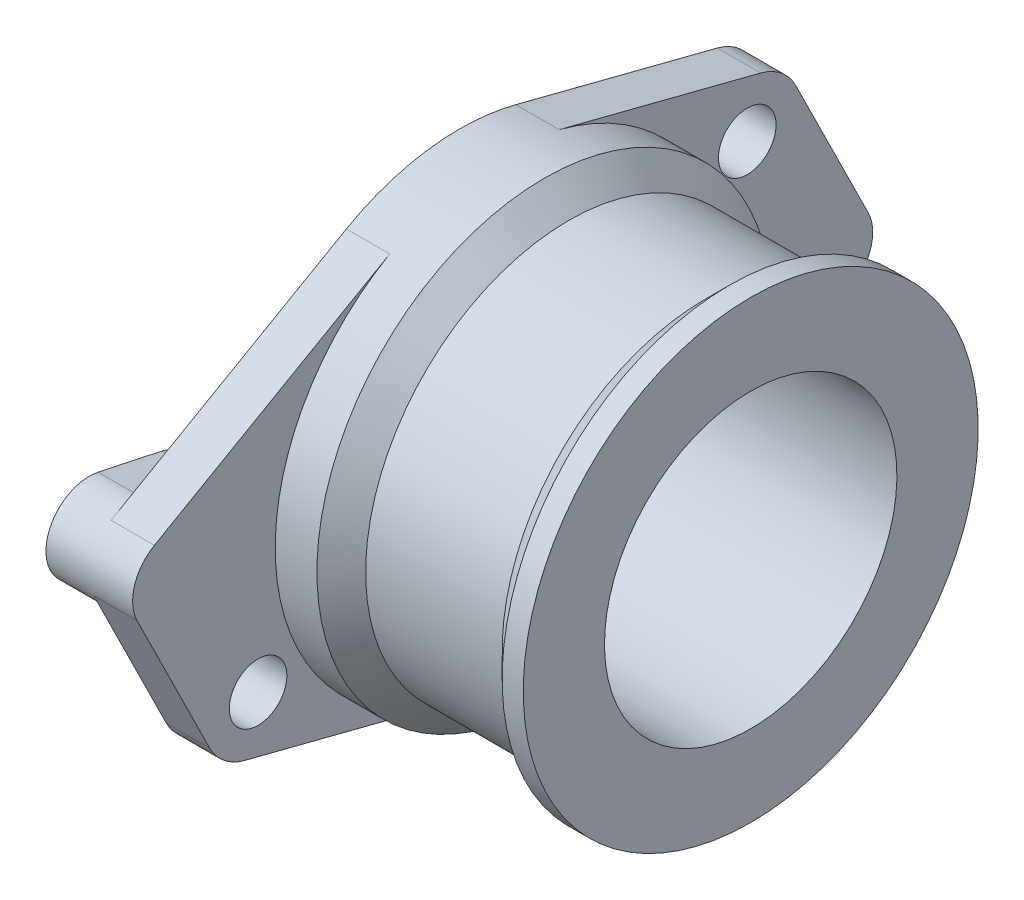
ISO-10303-21;
HEADER;
FILE_DESCRIPTION(('STEP AP214'),'2;1');
FILE_NAME('part.step','',(''),(''),'','','');
FILE_SCHEMA(('AUTOMOTIVE_DESIGN { 1 0 10303 214 1 1 1 1 }'));
ENDSEC;
DATA;
#1=APPLICATION_CONTEXT('core data for automotive mechanical design processes');
#2=APPLICATION_PROTOCOL_DEFINITION('international standard','automotive_design',2000,#1);
#3=PRODUCT_CONTEXT('',#1,'mechanical');
#4=PRODUCT('Part','Part','',(#3));
#5=PRODUCT_RELATED_PRODUCT_CATEGORY('part','',(#4));
#6=PRODUCT_DEFINITION_FORMATION('','',#4);
#7=PRODUCT_DEFINITION_CONTEXT('part definition',#1,'design');
#8=PRODUCT_DEFINITION('design','',#6,#7);
#9=PRODUCT_DEFINITION_SHAPE('','',#8);
#10=(LENGTH_UNIT() NAMED_UNIT(*) SI_UNIT(.MILLI.,.METRE.));
#11=(NAMED_UNIT(*) PLANE_ANGLE_UNIT() SI_UNIT($,.RADIAN.));
#12=(NAMED_UNIT(*) SI_UNIT($,.STERADIAN.) SOLID_ANGLE_UNIT());
#13=UNCERTAINTY_MEASURE_WITH_UNIT(LENGTH_MEASURE(1.E-05),#10,'distance_accuracy_value','');
#14=(GEOMETRIC_REPRESENTATION_CONTEXT(3) GLOBAL_UNCERTAINTY_ASSIGNED_CONTEXT((#13)) GLOBAL_UNIT_ASSIGNED_CONTEXT((#10,
#11,#12)) REPRESENTATION_CONTEXT('',''));
#15=CARTESIAN_POINT('',(0.,0.,0.));
#16=DIRECTION('',(0.,0.,1.));
#17=DIRECTION('',(1.,0.,0.));
#18=AXIS2_PLACEMENT_3D('',#15,#16,#17);
#19=CARTESIAN_POINT('',(25.4,0.,0.));
#20=DIRECTION('',(-1.,0.,0.));
#21=DIRECTION('',(0.,1.,0.));
#22=AXIS2_PLACEMENT_3D('',#19,#20,#21);
#23=CYLINDRICAL_SURFACE('',#22,17.145);
#24=CARTESIAN_POINT('',(0.,0.,0.));
#25=DIRECTION('',(-1.,0.,0.));
#26=DIRECTION('',(0.,1.,0.));
#27=AXIS2_PLACEMENT_3D('',#24,#25,#26);
#28=CIRCLE('',#27,17.145);
#29=CARTESIAN_POINT('',(0.,17.145,0.));
#30=VERTEX_POINT('',#29);
#31=EDGE_CURVE('E10',#30,#30,#28,.T.);
#32=ORIENTED_EDGE('',*,*,#31,.T.);
#33=EDGE_LOOP('',(#32));
#34=FACE_BOUND('',#33,.T.);
#35=CARTESIAN_POINT('',(34.163,0.,0.));
#36=DIRECTION('',(-1.,0.,0.));
#37=DIRECTION('',(0.,1.,0.));
#38=AXIS2_PLACEMENT_3D('',#35,#36,#37);
#39=CIRCLE('',#38,17.145);
#40=CARTESIAN_POINT('',(34.163,17.145,0.));
#41=VERTEX_POINT('',#40);
#42=EDGE_CURVE('E23',#41,#41,#39,.T.);
#43=ORIENTED_EDGE('',*,*,#42,.F.);
#44=EDGE_LOOP('',(#43));
#45=FACE_BOUND('',#44,.T.);
#46=ADVANCED_FACE('F16',(#34,#45),#23,.F.);
#47=CARTESIAN_POINT('',(34.163,21.9075,0.));
#48=DIRECTION('',(1.,0.,0.));
#49=DIRECTION('',(0.,-1.,0.));
#50=AXIS2_PLACEMENT_3D('',#47,#48,#49);
#51=PLANE('',#50);
#52=ORIENTED_EDGE('',*,*,#42,.T.);
#53=EDGE_LOOP('',(#52));
#54=FACE_BOUND('',#53,.T.);
#55=CARTESIAN_POINT('',(34.163,0.,0.));
#56=DIRECTION('',(-1.,0.,0.));
#57=DIRECTION('',(0.,1.,0.));
#58=AXIS2_PLACEMENT_3D('',#55,#56,#57);
#59=CIRCLE('',#58,26.67);
#60=CARTESIAN_POINT('',(34.163,26.67,0.));
#61=VERTEX_POINT('',#60);
#62=EDGE_CURVE('E409',#61,#61,#59,.T.);
#63=ORIENTED_EDGE('',*,*,#62,.F.);
#64=EDGE_LOOP('',(#63));
#65=FACE_BOUND('',#64,.T.);
#66=ADVANCED_FACE('F414',(#54,#65),#51,.T.);
#67=CARTESIAN_POINT('',(25.4,0.,0.));
#68=DIRECTION('',(-1.,0.,0.));
#69=DIRECTION('',(0.,1.,0.));
#70=AXIS2_PLACEMENT_3D('',#67,#68,#69);
#71=CYLINDRICAL_SURFACE('',#70,26.67);
#72=CARTESIAN_POINT('',(31.6855,0.,0.));
#73=DIRECTION('',(-1.,0.,0.));
#74=DIRECTION('',(0.,1.,0.));
#75=AXIS2_PLACEMENT_3D('',#72,#73,#74);
#76=CIRCLE('',#75,26.67);
#77=CARTESIAN_POINT('',(31.6855,26.67,0.));
#78=VERTEX_POINT('',#77);
#79=EDGE_CURVE('E406',#78,#78,#76,.T.);
#80=ORIENTED_EDGE('',*,*,#79,.F.);
#81=EDGE_LOOP('',(#80));
#82=FACE_BOUND('',#81,.T.);
#83=ORIENTED_EDGE('',*,*,#62,.T.);
#84=EDGE_LOOP('',(#83));
#85=FACE_BOUND('',#84,.T.);
#86=ADVANCED_FACE('F423',(#82,#85),#71,.T.);
#87=CARTESIAN_POINT('',(31.6855,0.,0.));
#88=DIRECTION('',(1.,0.,0.));
#89=DIRECTION('',(0.,-1.,0.));
#90=AXIS2_PLACEMENT_3D('',#87,#88,#89);
#91=CONICAL_SURFACE('',#90,26.67,0.785398163397448);
#92=CARTESIAN_POINT('',(28.828,0.,0.));
#93=DIRECTION('',(-1.,0.,0.));
#94=DIRECTION('',(0.,1.,0.));
#95=AXIS2_PLACEMENT_3D('',#92,#93,#94);
#96=CIRCLE('',#95,23.8125);
#97=CARTESIAN_POINT('',(28.828,23.8125,0.));
#98=VERTEX_POINT('',#97);
#99=EDGE_CURVE('E403',#98,#98,#96,.T.);
#100=ORIENTED_EDGE('',*,*,#99,.F.);
#101=EDGE_LOOP('',(#100));
#102=FACE_BOUND('',#101,.T.);
#103=ORIENTED_EDGE('',*,*,#79,.T.);
#104=EDGE_LOOP('',(#103));
#105=FACE_BOUND('',#104,.T.);
#106=ADVANCED_FACE('F451',(#102,#105),#91,.T.);
#107=CARTESIAN_POINT('',(25.4,0.,0.));
#108=DIRECTION('',(-1.,0.,0.));
#109=DIRECTION('',(0.,1.,0.));
#110=AXIS2_PLACEMENT_3D('',#107,#108,#109);
#111=CYLINDRICAL_SURFACE('',#110,23.8125);
#112=CARTESIAN_POINT('',(12.828,0.,0.));
#113=DIRECTION('',(-1.,0.,0.));
#114=DIRECTION('',(0.,1.,0.));
#115=AXIS2_PLACEMENT_3D('',#112,#113,#114);
#116=CIRCLE('',#115,23.8125);
#117=CARTESIAN_POINT('',(12.828,23.8125,0.));
#118=VERTEX_POINT('',#117);
#119=EDGE_CURVE('E400',#118,#118,#116,.T.);
#120=ORIENTED_EDGE('',*,*,#119,.F.);
#121=EDGE_LOOP('',(#120));
#122=FACE_BOUND('',#121,.T.);
#123=ORIENTED_EDGE('',*,*,#99,.T.);
#124=EDGE_LOOP('',(#123));
#125=FACE_BOUND('',#124,.T.);
#126=ADVANCED_FACE('F447',(#122,#125),#111,.T.);
#127=CARTESIAN_POINT('',(12.828,0.,0.));
#128=DIRECTION('',(-1.,0.,0.));
#129=DIRECTION('',(0.,1.,0.));
#130=AXIS2_PLACEMENT_3D('',#127,#128,#129);
#131=CONICAL_SURFACE('',#130,23.8125,0.785398163397448);
#132=CARTESIAN_POINT('',(9.9705,0.,0.));
#133=DIRECTION('',(-1.,0.,0.));
#134=DIRECTION('',(0.,1.,0.));
#135=AXIS2_PLACEMENT_3D('',#132,#133,#134);
#136=CIRCLE('',#135,26.67);
#137=CARTESIAN_POINT('',(9.9705,26.67,0.));
#138=VERTEX_POINT('',#137);
#139=EDGE_CURVE('E397',#138,#138,#136,.T.);
#140=ORIENTED_EDGE('',*,*,#139,.F.);
#141=EDGE_LOOP('',(#140));
#142=FACE_BOUND('',#141,.T.);
#143=ORIENTED_EDGE('',*,*,#119,.T.);
#144=EDGE_LOOP('',(#143));
#145=FACE_BOUND('',#144,.T.);
#146=ADVANCED_FACE('F440',(#142,#145),#131,.T.);
#147=CARTESIAN_POINT('',(25.4,0.,0.));
#148=DIRECTION('',(-1.,0.,0.));
#149=DIRECTION('',(0.,1.,0.));
#150=AXIS2_PLACEMENT_3D('',#147,#148,#149);
#151=CYLINDRICAL_SURFACE('',#150,26.67);
#152=DIRECTION('',(-1.,0.,0.));
#153=VECTOR('',#152,1.);
#154=CARTESIAN_POINT('',(5.08,-23.149264780248,-13.2438831214252));
#155=LINE('',#154,#153);
#156=CARTESIAN_POINT('',(5.08,-23.149264780248,-13.2438831214252));
#157=VERTEX_POINT('',#156);
#158=CARTESIAN_POINT('',(0.,-23.149264780248,-13.2438831214252));
#159=VERTEX_POINT('',#158);
#160=EDGE_CURVE('E30',#157,#159,#155,.T.);
#161=ORIENTED_EDGE('',*,*,#160,.F.);
#162=CARTESIAN_POINT('',(5.08,0.,0.));
#163=DIRECTION('',(1.,0.,0.));
#164=DIRECTION('',(0.,1.,0.));
#165=AXIS2_PLACEMENT_3D('',#162,#163,#164);
#166=CIRCLE('',#165,26.67);
#167=CARTESIAN_POINT('',(5.08,25.8343906003052,-6.62368193007953));
#168=VERTEX_POINT('',#167);
#169=EDGE_CURVE('E35',#157,#168,#166,.T.);
#170=ORIENTED_EDGE('',*,*,#169,.T.);
#171=DIRECTION('',(-1.,0.,0.));
#172=VECTOR('',#171,1.);
#173=CARTESIAN_POINT('',(5.08,25.8343906003052,-6.62368193007953));
#174=LINE('',#173,#172);
#175=CARTESIAN_POINT('',(0.,25.8343906003052,-6.62368193007954));
#176=VERTEX_POINT('',#175);
#177=EDGE_CURVE('E393',#168,#176,#174,.T.);
#178=ORIENTED_EDGE('',*,*,#177,.T.);
#179=CARTESIAN_POINT('',(0.,0.,0.));
#180=DIRECTION('',(-1.,0.,0.));
#181=DIRECTION('',(0.,1.,0.));
#182=AXIS2_PLACEMENT_3D('',#179,#180,#181);
#183=CIRCLE('',#182,26.67);
#184=CARTESIAN_POINT('',(0.,23.149264780248,13.2438831214252));
#185=VERTEX_POINT('',#184);
#186=EDGE_CURVE('E390',#185,#176,#183,.T.);
#187=ORIENTED_EDGE('',*,*,#186,.F.);
#188=DIRECTION('',(-1.,0.,0.));
#189=VECTOR('',#188,1.);
#190=CARTESIAN_POINT('',(5.08,23.149264780248,13.2438831214252));
#191=LINE('',#190,#189);
#192=CARTESIAN_POINT('',(5.08,23.149264780248,13.2438831214252));
#193=VERTEX_POINT('',#192);
#194=EDGE_CURVE('E387',#193,#185,#191,.T.);
#195=ORIENTED_EDGE('',*,*,#194,.F.);
#196=CARTESIAN_POINT('',(5.08,0.,0.));
#197=DIRECTION('',(1.,0.,0.));
#198=DIRECTION('',(0.,-1.,0.));
#199=AXIS2_PLACEMENT_3D('',#196,#197,#198);
#200=CIRCLE('',#199,26.67);
#201=CARTESIAN_POINT('',(5.08,-25.8343906003052,6.62368193007953));
#202=VERTEX_POINT('',#201);
#203=EDGE_CURVE('E384',#193,#202,#200,.T.);
#204=ORIENTED_EDGE('',*,*,#203,.T.);
#205=DIRECTION('',(-1.,0.,0.));
#206=VECTOR('',#205,1.);
#207=CARTESIAN_POINT('',(5.08,-25.8343906003052,6.62368193007953));
#208=LINE('',#207,#206);
#209=CARTESIAN_POINT('',(0.,-25.8343906003052,6.62368193007954));
#210=VERTEX_POINT('',#209);
#211=EDGE_CURVE('E382',#202,#210,#208,.T.);
#212=ORIENTED_EDGE('',*,*,#211,.T.);
#213=EDGE_CURVE('E385',#159,#210,#183,.T.);
#214=ORIENTED_EDGE('',*,*,#213,.F.);
#215=EDGE_LOOP('',(#161,#170,#178,#187,#195,#204,#212,#214));
#216=FACE_BOUND('',#215,.T.);
#217=ORIENTED_EDGE('',*,*,#139,.T.);
#218=EDGE_LOOP('',(#217));
#219=FACE_BOUND('',#218,.T.);
#220=ADVANCED_FACE('F429',(#216,#219),#151,.T.);
#221=CARTESIAN_POINT('',(0.,21.9075,0.));
#222=DIRECTION('',(-1.,0.,0.));
#223=DIRECTION('',(0.,1.,0.));
#224=AXIS2_PLACEMENT_3D('',#221,#222,#223);
#225=PLANE('',#224);
#226=CARTESIAN_POINT('',(0.,-2.96616859215303,-38.3206980670754));
#227=DIRECTION('',(-1.,0.,0.));
#228=DIRECTION('',(0.,1.,0.));
#229=AXIS2_PLACEMENT_3D('',#226,#227,#228);
#230=CIRCLE('',#229,5.06597043665619);
#231=CARTESIAN_POINT('',(0.,-7.36337485413513,-40.8363756208688));
#232=VERTEX_POINT('',#231);
#233=CARTESIAN_POINT('',(0.,-7.92143542015649,-37.2674235879575));
#234=VERTEX_POINT('',#233);
#235=EDGE_CURVE('E379',#232,#234,#230,.T.);
#236=ORIENTED_EDGE('',*,*,#235,.F.);
#237=DIRECTION('',(0.,0.496583544110433,-0.867988930642967));
#238=VECTOR('',#237,1.);
#239=CARTESIAN_POINT('',(0.,-15.2563198171915,-27.0401293711472));
#240=LINE('',#239,#238);
#241=EDGE_CURVE('E376',#159,#232,#240,.T.);
#242=ORIENTED_EDGE('',*,*,#241,.F.);
#243=ORIENTED_EDGE('',*,*,#213,.T.);
#244=DIRECTION('',(0.,-0.248357027749514,-0.968668563940952));
#245=VECTOR('',#244,1.);
#246=CARTESIAN_POINT('',(0.,-22.8049435783379,18.4394542595182));
#247=LINE('',#246,#245);
#248=CARTESIAN_POINT('',(0.,-19.7754965563704,30.2552265889568));
#249=VERTEX_POINT('',#248);
#250=EDGE_CURVE('E373',#249,#210,#247,.T.);
#251=ORIENTED_EDGE('',*,*,#250,.F.);
#252=CARTESIAN_POINT('',(0.,-13.6244511753454,28.6781594627474));
#253=DIRECTION('',(1.,0.,0.));
#254=DIRECTION('',(0.,-1.,0.));
#255=AXIS2_PLACEMENT_3D('',#252,#253,#254);
#256=CIRCLE('',#255,6.35);
#257=CARTESIAN_POINT('',(0.,-16.4407923433444,34.3694442408475));
#258=VERTEX_POINT('',#257);
#259=EDGE_CURVE('E370',#258,#249,#256,.T.);
#260=ORIENTED_EDGE('',*,*,#259,.F.);
#261=DIRECTION('',(0.,-0.896265319385846,-0.443518294173067));
#262=VECTOR('',#261,1.);
#263=CARTESIAN_POINT('',(0.,-7.86073715879421,38.615297959666));
#264=LINE('',#263,#262);
#265=CARTESIAN_POINT('',(0.,0.719318025755973,42.8611516784846));
#266=VERTEX_POINT('',#265);
#267=EDGE_CURVE('E367',#266,#258,#264,.T.);
#268=ORIENTED_EDGE('',*,*,#267,.F.);
#269=CARTESIAN_POINT('',(0.,2.96616859215303,38.3206980670754));
#270=DIRECTION('',(-1.,0.,0.));
#271=DIRECTION('',(0.,-1.,0.));
#272=AXIS2_PLACEMENT_3D('',#269,#270,#271);
#273=CIRCLE('',#272,5.06597043665619);
#274=CARTESIAN_POINT('',(0.,-2.09980184450317,38.3206980670754));
#275=VERTEX_POINT('',#274);
#276=EDGE_CURVE('E364',#275,#266,#273,.T.);
#277=ORIENTED_EDGE('',*,*,#276,.F.);
#278=DIRECTION('',(0.,0.,1.));
#279=VECTOR('',#278,1.);
#280=CARTESIAN_POINT('',(0.,-2.09980184450297,34.5141495879367));
#281=LINE('',#280,#279);
#282=CARTESIAN_POINT('',(0.,-2.09980184450297,30.7076011087981));
#283=VERTEX_POINT('',#282);
#284=EDGE_CURVE('E361',#283,#275,#281,.T.);
#285=ORIENTED_EDGE('',*,*,#284,.F.);
#286=CARTESIAN_POINT('',(0.,2.16599985834969,30.7076011087981));
#287=DIRECTION('',(-1.,0.,0.));
#288=DIRECTION('',(0.,-1.,0.));
#289=AXIS2_PLACEMENT_3D('',#286,#287,#288);
#290=CIRCLE('',#289,4.26580170285296);
#291=CARTESIAN_POINT('',(0.,0.827745861664099,26.6571517005943));
#292=VERTEX_POINT('',#291);
#293=EDGE_CURVE('E358',#292,#283,#290,.T.);
#294=ORIENTED_EDGE('',*,*,#293,.F.);
#295=CARTESIAN_POINT('',(0.,2.62702186393237E-13,3.59434704222395E-12));
#296=DIRECTION('',(1.,0.,0.));
#297=DIRECTION('',(0.,-1.,0.));
#298=AXIS2_PLACEMENT_3D('',#295,#296,#297);
#299=CIRCLE('',#298,26.6699999999964);
#300=CARTESIAN_POINT('',(0.,2.92242481679052,26.509400845553));
#301=VERTEX_POINT('',#300);
#302=EDGE_CURVE('E355',#301,#292,#299,.T.);
#303=ORIENTED_EDGE('',*,*,#302,.F.);
#304=CARTESIAN_POINT('',(0.,2.1659998583497,30.7076011087981));
#305=DIRECTION('',(-1.,0.,0.));
#306=DIRECTION('',(0.,-1.,0.));
#307=AXIS2_PLACEMENT_3D('',#304,#305,#306);
#308=CIRCLE('',#307,4.26580170285296);
#309=CARTESIAN_POINT('',(0.,6.33858355920112,29.8206910640629));
#310=VERTEX_POINT('',#309);
#311=EDGE_CURVE('E352',#310,#301,#308,.T.);
#312=ORIENTED_EDGE('',*,*,#311,.F.);
#313=DIRECTION('',(0.,-0.207911690817758,-0.978147600733806));
#314=VECTOR('',#313,1.);
#315=CARTESIAN_POINT('',(0.,7.1300094896788,33.5440573260102));
#316=LINE('',#315,#314);
#317=CARTESIAN_POINT('',(0.,7.92143542015648,37.2674235879575));
#318=VERTEX_POINT('',#317);
#319=EDGE_CURVE('E349',#318,#310,#316,.T.);
#320=ORIENTED_EDGE('',*,*,#319,.F.);
#321=CARTESIAN_POINT('',(0.,7.36337485413512,40.8363756208688));
#322=VERTEX_POINT('',#321);
#323=EDGE_CURVE('E348',#322,#318,#273,.T.);
#324=ORIENTED_EDGE('',*,*,#323,.F.);
#325=DIRECTION('',(0.,-0.496583544110433,0.867988930642967));
#326=VECTOR('',#325,1.);
#327=CARTESIAN_POINT('',(0.,15.2563198171915,27.0401293711472));
#328=LINE('',#327,#326);
#329=EDGE_CURVE('E345',#185,#322,#328,.T.);
#330=ORIENTED_EDGE('',*,*,#329,.F.);
#331=ORIENTED_EDGE('',*,*,#186,.T.);
#332=DIRECTION('',(0.,0.248357027749514,0.968668563940952));
#333=VECTOR('',#332,1.);
#334=CARTESIAN_POINT('',(0.,22.8049435783379,-18.4394542595182));
#335=LINE('',#334,#333);
#336=CARTESIAN_POINT('',(0.,19.7754965563704,-30.2552265889568));
#337=VERTEX_POINT('',#336);
#338=EDGE_CURVE('E342',#337,#176,#335,.T.);
#339=ORIENTED_EDGE('',*,*,#338,.F.);
#340=CARTESIAN_POINT('',(0.,13.6244511753454,-28.6781594627474));
#341=DIRECTION('',(1.,0.,0.));
#342=DIRECTION('',(0.,1.,0.));
#343=AXIS2_PLACEMENT_3D('',#340,#341,#342);
#344=CIRCLE('',#343,6.35);
#345=CARTESIAN_POINT('',(0.,16.4407923433444,-34.3694442408475));
#346=VERTEX_POINT('',#345);
#347=EDGE_CURVE('E339',#346,#337,#344,.T.);
#348=ORIENTED_EDGE('',*,*,#347,.F.);
#349=DIRECTION('',(0.,0.896265319385846,0.443518294173067));
#350=VECTOR('',#349,1.);
#351=CARTESIAN_POINT('',(0.,7.86073715879421,-38.615297959666));
#352=LINE('',#351,#350);
#353=CARTESIAN_POINT('',(0.,-0.719318025755987,-42.8611516784846));
#354=VERTEX_POINT('',#353);
#355=EDGE_CURVE('E336',#354,#346,#352,.T.);
#356=ORIENTED_EDGE('',*,*,#355,.F.);
#357=CARTESIAN_POINT('',(0.,2.09980184450316,-38.3206980670754));
#358=VERTEX_POINT('',#357);
#359=EDGE_CURVE('E335',#358,#354,#230,.T.);
#360=ORIENTED_EDGE('',*,*,#359,.F.);
#361=DIRECTION('',(0.,0.,-1.));
#362=VECTOR('',#361,1.);
#363=CARTESIAN_POINT('',(0.,2.09980184450297,-34.5141495879367));
#364=LINE('',#363,#362);
#365=CARTESIAN_POINT('',(0.,2.09980184450296,-30.7076011087981));
#366=VERTEX_POINT('',#365);
#367=EDGE_CURVE('E332',#366,#358,#364,.T.);
#368=ORIENTED_EDGE('',*,*,#367,.F.);
#369=CARTESIAN_POINT('',(0.,-2.16599985834969,-30.7076011087981));
#370=DIRECTION('',(-1.,0.,0.));
#371=DIRECTION('',(0.,1.,0.));
#372=AXIS2_PLACEMENT_3D('',#369,#370,#371);
#373=CIRCLE('',#372,4.26580170285296);
#374=CARTESIAN_POINT('',(0.,-0.827745861664102,-26.6571517005943));
#375=VERTEX_POINT('',#374);
#376=EDGE_CURVE('E329',#375,#366,#373,.T.);
#377=ORIENTED_EDGE('',*,*,#376,.F.);
#378=CARTESIAN_POINT('',(0.,-2.62702186393238E-13,-3.59434704222395E-12));
#379=DIRECTION('',(1.,0.,0.));
#380=DIRECTION('',(0.,1.,0.));
#381=AXIS2_PLACEMENT_3D('',#378,#379,#380);
#382=CIRCLE('',#381,26.6699999999964);
#383=CARTESIAN_POINT('',(0.,-2.92242481679053,-26.509400845553));
#384=VERTEX_POINT('',#383);
#385=EDGE_CURVE('E326',#384,#375,#382,.T.);
#386=ORIENTED_EDGE('',*,*,#385,.F.);
#387=CARTESIAN_POINT('',(0.,-2.1659998583497,-30.7076011087981));
#388=DIRECTION('',(-1.,0.,0.));
#389=DIRECTION('',(0.,1.,0.));
#390=AXIS2_PLACEMENT_3D('',#387,#388,#389);
#391=CIRCLE('',#390,4.26580170285296);
#392=CARTESIAN_POINT('',(0.,-6.33858355920112,-29.8206910640629));
#393=VERTEX_POINT('',#392);
#394=EDGE_CURVE('E324',#393,#384,#391,.T.);
#395=ORIENTED_EDGE('',*,*,#394,.F.);
#396=DIRECTION('',(0.,0.207911690817758,0.978147600733806));
#397=VECTOR('',#396,1.);
#398=CARTESIAN_POINT('',(0.,-7.1300094896788,-33.5440573260102));
#399=LINE('',#398,#397);
#400=EDGE_CURVE('E194',#234,#393,#399,.T.);
#401=ORIENTED_EDGE('',*,*,#400,.F.);
#402=EDGE_LOOP('',(#236,#242,#243,#251,#260,#268,#277,#285,#294,#303,#312,#320,#324,#330,#331,
#339,#348,#356,#360,#368,#377,#386,#395,#401));
#403=FACE_BOUND('',#402,.T.);
#404=CARTESIAN_POINT('',(0.,13.6244511753454,-28.6781594627474));
#405=DIRECTION('',(1.,0.,0.));
#406=DIRECTION('',(0.,-1.,0.));
#407=AXIS2_PLACEMENT_3D('',#404,#405,#406);
#408=CIRCLE('',#407,3.3782);
#409=CARTESIAN_POINT('',(0.,10.2462511753454,-28.6781594627474));
#410=VERTEX_POINT('',#409);
#411=EDGE_CURVE('E320',#410,#410,#408,.T.);
#412=ORIENTED_EDGE('',*,*,#411,.T.);
#413=EDGE_LOOP('',(#412));
#414=FACE_BOUND('',#413,.T.);
#415=CARTESIAN_POINT('',(0.,-13.6244511753454,28.6781594627474));
#416=DIRECTION('',(1.,0.,0.));
#417=DIRECTION('',(0.,-1.,0.));
#418=AXIS2_PLACEMENT_3D('',#415,#416,#417);
#419=CIRCLE('',#418,3.3782);
#420=CARTESIAN_POINT('',(0.,-17.0026511753454,28.6781594627474));
#421=VERTEX_POINT('',#420);
#422=EDGE_CURVE('E317',#421,#421,#419,.T.);
#423=ORIENTED_EDGE('',*,*,#422,.T.);
#424=EDGE_LOOP('',(#423));
#425=FACE_BOUND('',#424,.T.);
#426=ORIENTED_EDGE('',*,*,#31,.F.);
#427=EDGE_LOOP('',(#426));
#428=FACE_BOUND('',#427,.T.);
#429=ADVANCED_FACE('F426',(#403,#414,#425,#428),#225,.T.);
#430=CARTESIAN_POINT('',(5.08,15.2563198171915,27.0401293711472));
#431=DIRECTION('',(0.,-0.867988930642967,-0.496583544110433));
#432=DIRECTION('',(0.,0.496583544110433,-0.867988930642967));
#433=AXIS2_PLACEMENT_3D('',#430,#431,#432);
#434=PLANE('',#433);
#435=ORIENTED_EDGE('',*,*,#329,.T.);
#436=DIRECTION('',(-1.,0.,0.));
#437=VECTOR('',#436,1.);
#438=CARTESIAN_POINT('',(5.08,7.36337485413512,40.8363756208688));
#439=LINE('',#438,#437);
#440=CARTESIAN_POINT('',(5.08,7.36337485413512,40.8363756208688));
#441=VERTEX_POINT('',#440);
#442=EDGE_CURVE('E314',#441,#322,#439,.T.);
#443=ORIENTED_EDGE('',*,*,#442,.F.);
#444=DIRECTION('',(0.,-0.496583544110433,0.867988930642967));
#445=VECTOR('',#444,1.);
#446=CARTESIAN_POINT('',(5.08,15.2563198171915,27.0401293711472));
#447=LINE('',#446,#445);
#448=EDGE_CURVE('E311',#193,#441,#447,.T.);
#449=ORIENTED_EDGE('',*,*,#448,.F.);
#450=ORIENTED_EDGE('',*,*,#194,.T.);
#451=EDGE_LOOP('',(#435,#443,#449,#450));
#452=FACE_BOUND('',#451,.T.);
#453=ADVANCED_FACE('F428',(#452),#434,.F.);
#454=CARTESIAN_POINT('',(5.08,2.96616859215303,38.3206980670754));
#455=DIRECTION('',(-1.,0.,0.));
#456=DIRECTION('',(0.,1.,0.));
#457=AXIS2_PLACEMENT_3D('',#454,#455,#456);
#458=CYLINDRICAL_SURFACE('',#457,5.06597043665619);
#459=ORIENTED_EDGE('',*,*,#442,.T.);
#460=ORIENTED_EDGE('',*,*,#323,.T.);
#461=DIRECTION('',(1.,0.,0.));
#462=VECTOR('',#461,1.);
#463=CARTESIAN_POINT('',(-5.08,7.92143542015648,37.2674235879575));
#464=LINE('',#463,#462);
#465=CARTESIAN_POINT('',(-5.08,7.92143542015648,37.2674235879575));
#466=VERTEX_POINT('',#465);
#467=EDGE_CURVE('E308',#466,#318,#464,.T.);
#468=ORIENTED_EDGE('',*,*,#467,.F.);
#469=CARTESIAN_POINT('',(-5.08,2.96616859215303,38.3206980670754));
#470=DIRECTION('',(-1.,0.,0.));
#471=DIRECTION('',(0.,-1.,0.));
#472=AXIS2_PLACEMENT_3D('',#469,#470,#471);
#473=CIRCLE('',#472,5.06597043665619);
#474=CARTESIAN_POINT('',(-5.08,-2.09980184450317,38.3206980670754));
#475=VERTEX_POINT('',#474);
#476=EDGE_CURVE('E305',#475,#466,#473,.T.);
#477=ORIENTED_EDGE('',*,*,#476,.F.);
#478=DIRECTION('',(1.,0.,0.));
#479=VECTOR('',#478,1.);
#480=CARTESIAN_POINT('',(-5.08,-2.09980184450317,38.3206980670754));
#481=LINE('',#480,#479);
#482=EDGE_CURVE('E302',#475,#275,#481,.T.);
#483=ORIENTED_EDGE('',*,*,#482,.T.);
#484=ORIENTED_EDGE('',*,*,#276,.T.);
#485=DIRECTION('',(-1.,0.,0.));
#486=VECTOR('',#485,1.);
#487=CARTESIAN_POINT('',(5.08,0.719318025755973,42.8611516784846));
#488=LINE('',#487,#486);
#489=CARTESIAN_POINT('',(5.08,0.719318025755973,42.8611516784846));
#490=VERTEX_POINT('',#489);
#491=EDGE_CURVE('E299',#490,#266,#488,.T.);
#492=ORIENTED_EDGE('',*,*,#491,.F.);
#493=CARTESIAN_POINT('',(5.08,2.96616859215303,38.3206980670754));
#494=DIRECTION('',(-1.,0.,0.));
#495=DIRECTION('',(0.,-1.,0.));
#496=AXIS2_PLACEMENT_3D('',#493,#494,#495);
#497=CIRCLE('',#496,5.06597043665619);
#498=EDGE_CURVE('E296',#490,#441,#497,.T.);
#499=ORIENTED_EDGE('',*,*,#498,.T.);
#500=EDGE_LOOP('',(#459,#460,#468,#477,#483,#484,#492,#499));
#501=FACE_BOUND('',#500,.T.);
#502=ADVANCED_FACE('F437',(#501),#458,.T.);
#503=CARTESIAN_POINT('',(5.08,-7.86073715879421,38.615297959666));
#504=DIRECTION('',(0.,0.443518294173067,-0.896265319385846));
#505=DIRECTION('',(0.,0.896265319385846,0.443518294173067));
#506=AXIS2_PLACEMENT_3D('',#503,#504,#505);
#507=PLANE('',#506);
#508=ORIENTED_EDGE('',*,*,#267,.T.);
#509=DIRECTION('',(-1.,0.,0.));
#510=VECTOR('',#509,1.);
#511=CARTESIAN_POINT('',(5.08,-16.4407923433444,34.3694442408475));
#512=LINE('',#511,#510);
#513=CARTESIAN_POINT('',(5.08,-16.4407923433444,34.3694442408475));
#514=VERTEX_POINT('',#513);
#515=EDGE_CURVE('E293',#514,#258,#512,.T.);
#516=ORIENTED_EDGE('',*,*,#515,.F.);
#517=DIRECTION('',(0.,-0.896265319385846,-0.443518294173067));
#518=VECTOR('',#517,1.);
#519=CARTESIAN_POINT('',(5.08,-7.86073715879421,38.615297959666));
#520=LINE('',#519,#518);
#521=EDGE_CURVE('E290',#490,#514,#520,.T.);
#522=ORIENTED_EDGE('',*,*,#521,.F.);
#523=ORIENTED_EDGE('',*,*,#491,.T.);
#524=EDGE_LOOP('',(#508,#516,#522,#523));
#525=FACE_BOUND('',#524,.T.);
#526=ADVANCED_FACE('F512',(#525),#507,.F.);
#527=CARTESIAN_POINT('',(5.08,-13.6244511753454,28.6781594627474));
#528=DIRECTION('',(-1.,0.,0.));
#529=DIRECTION('',(0.,1.,0.));
#530=AXIS2_PLACEMENT_3D('',#527,#528,#529);
#531=CYLINDRICAL_SURFACE('',#530,6.35);
#532=ORIENTED_EDGE('',*,*,#259,.T.);
#533=DIRECTION('',(-1.,0.,0.));
#534=VECTOR('',#533,1.);
#535=CARTESIAN_POINT('',(5.08,-19.7754965563704,30.2552265889568));
#536=LINE('',#535,#534);
#537=CARTESIAN_POINT('',(5.08,-19.7754965563704,30.2552265889568));
#538=VERTEX_POINT('',#537);
#539=EDGE_CURVE('E287',#538,#249,#536,.T.);
#540=ORIENTED_EDGE('',*,*,#539,.F.);
#541=CARTESIAN_POINT('',(5.08,-13.6244511753454,28.6781594627474));
#542=DIRECTION('',(1.,0.,0.));
#543=DIRECTION('',(0.,-1.,0.));
#544=AXIS2_PLACEMENT_3D('',#541,#542,#543);
#545=CIRCLE('',#544,6.35);
#546=EDGE_CURVE('E284',#514,#538,#545,.T.);
#547=ORIENTED_EDGE('',*,*,#546,.F.);
#548=ORIENTED_EDGE('',*,*,#515,.T.);
#549=EDGE_LOOP('',(#532,#540,#547,#548));
#550=FACE_BOUND('',#549,.T.);
#551=ADVANCED_FACE('F521',(#550),#531,.T.);
#552=CARTESIAN_POINT('',(5.08,-22.8049435783379,18.4394542595182));
#553=DIRECTION('',(0.,0.968668563940953,-0.248357027749514));
#554=DIRECTION('',(0.,0.248357027749514,0.968668563940953));
#555=AXIS2_PLACEMENT_3D('',#552,#553,#554);
#556=PLANE('',#555);
#557=ORIENTED_EDGE('',*,*,#250,.T.);
#558=ORIENTED_EDGE('',*,*,#211,.F.);
#559=DIRECTION('',(0.,-0.248357027749514,-0.968668563940952));
#560=VECTOR('',#559,1.);
#561=CARTESIAN_POINT('',(5.08,-22.8049435783379,18.4394542595182));
#562=LINE('',#561,#560);
#563=EDGE_CURVE('E281',#538,#202,#562,.T.);
#564=ORIENTED_EDGE('',*,*,#563,.F.);
#565=ORIENTED_EDGE('',*,*,#539,.T.);
#566=EDGE_LOOP('',(#557,#558,#564,#565));
#567=FACE_BOUND('',#566,.T.);
#568=ADVANCED_FACE('F531',(#567),#556,.F.);
#569=CARTESIAN_POINT('',(5.08,0.,4.95475168095318));
#570=DIRECTION('',(1.,0.,0.));
#571=DIRECTION('',(0.,0.,-1.));
#572=AXIS2_PLACEMENT_3D('',#569,#570,#571);
#573=PLANE('',#572);
#574=CARTESIAN_POINT('',(5.08,-13.6244511753454,28.6781594627474));
#575=DIRECTION('',(1.,0.,0.));
#576=DIRECTION('',(0.,-1.,0.));
#577=AXIS2_PLACEMENT_3D('',#574,#575,#576);
#578=CIRCLE('',#577,3.3782);
#579=CARTESIAN_POINT('',(5.08,-17.0026511753454,28.6781594627474));
#580=VERTEX_POINT('',#579);
#581=EDGE_CURVE('E278',#580,#580,#578,.T.);
#582=ORIENTED_EDGE('',*,*,#581,.F.);
#583=EDGE_LOOP('',(#582));
#584=FACE_BOUND('',#583,.T.);
#585=ORIENTED_EDGE('',*,*,#203,.F.);
#586=ORIENTED_EDGE('',*,*,#448,.T.);
#587=ORIENTED_EDGE('',*,*,#498,.F.);
#588=ORIENTED_EDGE('',*,*,#521,.T.);
#589=ORIENTED_EDGE('',*,*,#546,.T.);
#590=ORIENTED_EDGE('',*,*,#563,.T.);
#591=EDGE_LOOP('',(#585,#586,#587,#588,#589,#590));
#592=FACE_BOUND('',#591,.T.);
#593=ADVANCED_FACE('F541',(#584,#592),#573,.T.);
#594=CARTESIAN_POINT('',(0.,-13.6244511753454,28.6781594627474));
#595=DIRECTION('',(1.,0.,0.));
#596=DIRECTION('',(0.,-1.,0.));
#597=AXIS2_PLACEMENT_3D('',#594,#595,#596);
#598=CYLINDRICAL_SURFACE('',#597,3.3782);
#599=ORIENTED_EDGE('',*,*,#581,.T.);
#600=EDGE_LOOP('',(#599));
#601=FACE_BOUND('',#600,.T.);
#602=ORIENTED_EDGE('',*,*,#422,.F.);
#603=EDGE_LOOP('',(#602));
#604=FACE_BOUND('',#603,.T.);
#605=ADVANCED_FACE('F551',(#601,#604),#598,.F.);
#606=CARTESIAN_POINT('',(-5.08,-2.09980184450297,34.5141495879367));
#607=DIRECTION('',(0.,1.,0.));
#608=DIRECTION('',(0.,0.,1.));
#609=AXIS2_PLACEMENT_3D('',#606,#607,#608);
#610=PLANE('',#609);
#611=ORIENTED_EDGE('',*,*,#284,.T.);
#612=ORIENTED_EDGE('',*,*,#482,.F.);
#613=DIRECTION('',(0.,0.,1.));
#614=VECTOR('',#613,1.);
#615=CARTESIAN_POINT('',(-5.08,-2.09980184450297,34.5141495879367));
#616=LINE('',#615,#614);
#617=CARTESIAN_POINT('',(-5.08,-2.09980184450297,30.7076011087981));
#618=VERTEX_POINT('',#617);
#619=EDGE_CURVE('E275',#618,#475,#616,.T.);
#620=ORIENTED_EDGE('',*,*,#619,.F.);
#621=DIRECTION('',(1.,0.,0.));
#622=VECTOR('',#621,1.);
#623=CARTESIAN_POINT('',(-5.08,-2.09980184450297,30.7076011087981));
#624=LINE('',#623,#622);
#625=EDGE_CURVE('E272',#618,#283,#624,.T.);
#626=ORIENTED_EDGE('',*,*,#625,.T.);
#627=EDGE_LOOP('',(#611,#612,#620,#626));
#628=FACE_BOUND('',#627,.T.);
#629=ADVANCED_FACE('F561',(#628),#610,.F.);
#630=CARTESIAN_POINT('',(-5.08,2.16599985834969,30.7076011087981));
#631=DIRECTION('',(1.,0.,0.));
#632=DIRECTION('',(0.,-1.,0.));
#633=AXIS2_PLACEMENT_3D('',#630,#631,#632);
#634=CYLINDRICAL_SURFACE('',#633,4.26580170285296);
#635=ORIENTED_EDGE('',*,*,#293,.T.);
#636=ORIENTED_EDGE('',*,*,#625,.F.);
#637=CARTESIAN_POINT('',(-5.08,2.16599985834969,30.7076011087981));
#638=DIRECTION('',(-1.,0.,0.));
#639=DIRECTION('',(0.,-1.,0.));
#640=AXIS2_PLACEMENT_3D('',#637,#638,#639);
#641=CIRCLE('',#640,4.26580170285296);
#642=CARTESIAN_POINT('',(-5.08,0.827745861664099,26.6571517005943));
#643=VERTEX_POINT('',#642);
#644=EDGE_CURVE('E269',#643,#618,#641,.T.);
#645=ORIENTED_EDGE('',*,*,#644,.F.);
#646=DIRECTION('',(1.,0.,0.));
#647=VECTOR('',#646,1.);
#648=CARTESIAN_POINT('',(-5.08,0.827745861664099,26.6571517005943));
#649=LINE('',#648,#647);
#650=EDGE_CURVE('E266',#643,#292,#649,.T.);
#651=ORIENTED_EDGE('',*,*,#650,.T.);
#652=EDGE_LOOP('',(#635,#636,#645,#651));
#653=FACE_BOUND('',#652,.T.);
#654=ADVANCED_FACE('F571',(#653),#634,.T.);
#655=CARTESIAN_POINT('',(-5.08,2.62702186393237E-13,3.59434704222395E-12));
#656=DIRECTION('',(1.,0.,0.));
#657=DIRECTION('',(0.,-1.,0.));
#658=AXIS2_PLACEMENT_3D('',#655,#656,#657);
#659=CYLINDRICAL_SURFACE('',#658,26.6699999999964);
#660=ORIENTED_EDGE('',*,*,#302,.T.);
#661=ORIENTED_EDGE('',*,*,#650,.F.);
#662=CARTESIAN_POINT('',(-5.08,2.62702186393237E-13,3.59434704222395E-12));
#663=DIRECTION('',(1.,0.,0.));
#664=DIRECTION('',(0.,-1.,0.));
#665=AXIS2_PLACEMENT_3D('',#662,#663,#664);
#666=CIRCLE('',#665,26.6699999999964);
#667=CARTESIAN_POINT('',(-5.08,2.92242481679052,26.509400845553));
#668=VERTEX_POINT('',#667);
#669=EDGE_CURVE('E263',#668,#643,#666,.T.);
#670=ORIENTED_EDGE('',*,*,#669,.F.);
#671=DIRECTION('',(1.,0.,0.));
#672=VECTOR('',#671,1.);
#673=CARTESIAN_POINT('',(-5.08,2.92242481679052,26.509400845553));
#674=LINE('',#673,#672);
#675=EDGE_CURVE('E260',#668,#301,#674,.T.);
#676=ORIENTED_EDGE('',*,*,#675,.T.);
#677=EDGE_LOOP('',(#660,#661,#670,#676));
#678=FACE_BOUND('',#677,.T.);
#679=ADVANCED_FACE('F581',(#678),#659,.F.);
#680=CARTESIAN_POINT('',(-5.08,2.1659998583497,30.7076011087981));
#681=DIRECTION('',(1.,0.,0.));
#682=DIRECTION('',(0.,-1.,0.));
#683=AXIS2_PLACEMENT_3D('',#680,#681,#682);
#684=CYLINDRICAL_SURFACE('',#683,4.26580170285296);
#685=ORIENTED_EDGE('',*,*,#311,.T.);
#686=ORIENTED_EDGE('',*,*,#675,.F.);
#687=CARTESIAN_POINT('',(-5.08,2.1659998583497,30.7076011087981));
#688=DIRECTION('',(-1.,0.,0.));
#689=DIRECTION('',(0.,-1.,0.));
#690=AXIS2_PLACEMENT_3D('',#687,#688,#689);
#691=CIRCLE('',#690,4.26580170285296);
#692=CARTESIAN_POINT('',(-5.08,6.33858355920112,29.8206910640629));
#693=VERTEX_POINT('',#692);
#694=EDGE_CURVE('E257',#693,#668,#691,.T.);
#695=ORIENTED_EDGE('',*,*,#694,.F.);
#696=DIRECTION('',(1.,0.,0.));
#697=VECTOR('',#696,1.);
#698=CARTESIAN_POINT('',(-5.08,6.33858355920112,29.8206910640629));
#699=LINE('',#698,#697);
#700=EDGE_CURVE('E254',#693,#310,#699,.T.);
#701=ORIENTED_EDGE('',*,*,#700,.T.);
#702=EDGE_LOOP('',(#685,#686,#695,#701));
#703=FACE_BOUND('',#702,.T.);
#704=ADVANCED_FACE('F591',(#703),#684,.T.);
#705=CARTESIAN_POINT('',(-5.08,7.1300094896788,33.5440573260102));
#706=DIRECTION('',(0.,-0.978147600733806,0.207911690817759));
#707=DIRECTION('',(0.,-0.207911690817759,-0.978147600733806));
#708=AXIS2_PLACEMENT_3D('',#705,#706,#707);
#709=PLANE('',#708);
#710=ORIENTED_EDGE('',*,*,#319,.T.);
#711=ORIENTED_EDGE('',*,*,#700,.F.);
#712=DIRECTION('',(0.,-0.207911690817758,-0.978147600733806));
#713=VECTOR('',#712,1.);
#714=CARTESIAN_POINT('',(-5.08,7.1300094896788,33.5440573260102));
#715=LINE('',#714,#713);
#716=EDGE_CURVE('E251',#466,#693,#715,.T.);
#717=ORIENTED_EDGE('',*,*,#716,.F.);
#718=ORIENTED_EDGE('',*,*,#467,.T.);
#719=EDGE_LOOP('',(#710,#711,#717,#718));
#720=FACE_BOUND('',#719,.T.);
#721=ADVANCED_FACE('F601',(#720),#709,.F.);
#722=CARTESIAN_POINT('',(-5.08,0.,4.95475168095318));
#723=DIRECTION('',(1.,0.,0.));
#724=DIRECTION('',(0.,0.,-1.));
#725=AXIS2_PLACEMENT_3D('',#722,#723,#724);
#726=PLANE('',#725);
#727=ORIENTED_EDGE('',*,*,#476,.T.);
#728=ORIENTED_EDGE('',*,*,#716,.T.);
#729=ORIENTED_EDGE('',*,*,#694,.T.);
#730=ORIENTED_EDGE('',*,*,#669,.T.);
#731=ORIENTED_EDGE('',*,*,#644,.T.);
#732=ORIENTED_EDGE('',*,*,#619,.T.);
#733=EDGE_LOOP('',(#727,#728,#729,#730,#731,#732));
#734=FACE_BOUND('',#733,.T.);
#735=ADVANCED_FACE('F611',(#734),#726,.F.);
#736=CARTESIAN_POINT('',(5.08,-15.2563198171915,-27.0401293711472));
#737=DIRECTION('',(0.,0.867988930642967,0.496583544110433));
#738=DIRECTION('',(0.,-0.496583544110433,0.867988930642967));
#739=AXIS2_PLACEMENT_3D('',#736,#737,#738);
#740=PLANE('',#739);
#741=ORIENTED_EDGE('',*,*,#241,.T.);
#742=DIRECTION('',(-1.,0.,0.));
#743=VECTOR('',#742,1.);
#744=CARTESIAN_POINT('',(5.08,-7.36337485413513,-40.8363756208688));
#745=LINE('',#744,#743);
#746=CARTESIAN_POINT('',(5.08,-7.36337485413513,-40.8363756208688));
#747=VERTEX_POINT('',#746);
#748=EDGE_CURVE('E248',#747,#232,#745,.T.);
#749=ORIENTED_EDGE('',*,*,#748,.F.);
#750=DIRECTION('',(0.,0.496583544110433,-0.867988930642967));
#751=VECTOR('',#750,1.);
#752=CARTESIAN_POINT('',(5.08,-15.2563198171915,-27.0401293711472));
#753=LINE('',#752,#751);
#754=EDGE_CURVE('E245',#157,#747,#753,.T.);
#755=ORIENTED_EDGE('',*,*,#754,.F.);
#756=ORIENTED_EDGE('',*,*,#160,.T.);
#757=EDGE_LOOP('',(#741,#749,#755,#756));
#758=FACE_BOUND('',#757,.T.);
#759=ADVANCED_FACE('F621',(#758),#740,.F.);
#760=CARTESIAN_POINT('',(5.08,-2.96616859215303,-38.3206980670754));
#761=DIRECTION('',(-1.,0.,0.));
#762=DIRECTION('',(0.,1.,0.));
#763=AXIS2_PLACEMENT_3D('',#760,#761,#762);
#764=CYLINDRICAL_SURFACE('',#763,5.06597043665619);
#765=ORIENTED_EDGE('',*,*,#748,.T.);
#766=ORIENTED_EDGE('',*,*,#235,.T.);
#767=DIRECTION('',(1.,0.,0.));
#768=VECTOR('',#767,1.);
#769=CARTESIAN_POINT('',(-5.08,-7.92143542015649,-37.2674235879575));
#770=LINE('',#769,#768);
#771=CARTESIAN_POINT('',(-5.08,-7.92143542015649,-37.2674235879575));
#772=VERTEX_POINT('',#771);
#773=EDGE_CURVE('E243',#772,#234,#770,.T.);
#774=ORIENTED_EDGE('',*,*,#773,.F.);
#775=CARTESIAN_POINT('',(-5.08,-2.96616859215303,-38.3206980670754));
#776=DIRECTION('',(-1.,0.,0.));
#777=DIRECTION('',(0.,1.,0.));
#778=AXIS2_PLACEMENT_3D('',#775,#776,#777);
#779=CIRCLE('',#778,5.06597043665619);
#780=CARTESIAN_POINT('',(-5.08,2.09980184450316,-38.3206980670754));
#781=VERTEX_POINT('',#780);
#782=EDGE_CURVE('E198',#781,#772,#779,.T.);
#783=ORIENTED_EDGE('',*,*,#782,.F.);
#784=DIRECTION('',(1.,0.,0.));
#785=VECTOR('',#784,1.);
#786=CARTESIAN_POINT('',(-5.08,2.09980184450316,-38.3206980670754));
#787=LINE('',#786,#785);
#788=EDGE_CURVE('E239',#781,#358,#787,.T.);
#789=ORIENTED_EDGE('',*,*,#788,.T.);
#790=ORIENTED_EDGE('',*,*,#359,.T.);
#791=DIRECTION('',(-1.,0.,0.));
#792=VECTOR('',#791,1.);
#793=CARTESIAN_POINT('',(5.08,-0.719318025755978,-42.8611516784846));
#794=LINE('',#793,#792);
#795=CARTESIAN_POINT('',(5.08,-0.719318025755978,-42.8611516784846));
#796=VERTEX_POINT('',#795);
#797=EDGE_CURVE('E236',#796,#354,#794,.T.);
#798=ORIENTED_EDGE('',*,*,#797,.F.);
#799=CARTESIAN_POINT('',(5.08,-2.96616859215303,-38.3206980670754));
#800=DIRECTION('',(-1.,0.,0.));
#801=DIRECTION('',(0.,1.,0.));
#802=AXIS2_PLACEMENT_3D('',#799,#800,#801);
#803=CIRCLE('',#802,5.06597043665619);
#804=EDGE_CURVE('E233',#796,#747,#803,.T.);
#805=ORIENTED_EDGE('',*,*,#804,.T.);
#806=EDGE_LOOP('',(#765,#766,#774,#783,#789,#790,#798,#805));
#807=FACE_BOUND('',#806,.T.);
#808=ADVANCED_FACE('F631',(#807),#764,.T.);
#809=CARTESIAN_POINT('',(5.08,7.86073715879421,-38.615297959666));
#810=DIRECTION('',(0.,-0.443518294173067,0.896265319385846));
#811=DIRECTION('',(0.,-0.896265319385846,-0.443518294173067));
#812=AXIS2_PLACEMENT_3D('',#809,#810,#811);
#813=PLANE('',#812);
#814=ORIENTED_EDGE('',*,*,#355,.T.);
#815=DIRECTION('',(-1.,0.,0.));
#816=VECTOR('',#815,1.);
#817=CARTESIAN_POINT('',(5.08,16.4407923433444,-34.3694442408475));
#818=LINE('',#817,#816);
#819=CARTESIAN_POINT('',(5.08,16.4407923433444,-34.3694442408475));
#820=VERTEX_POINT('',#819);
#821=EDGE_CURVE('E230',#820,#346,#818,.T.);
#822=ORIENTED_EDGE('',*,*,#821,.F.);
#823=DIRECTION('',(0.,0.896265319385846,0.443518294173067));
#824=VECTOR('',#823,1.);
#825=CARTESIAN_POINT('',(5.08,7.86073715879421,-38.615297959666));
#826=LINE('',#825,#824);
#827=EDGE_CURVE('E227',#796,#820,#826,.T.);
#828=ORIENTED_EDGE('',*,*,#827,.F.);
#829=ORIENTED_EDGE('',*,*,#797,.T.);
#830=EDGE_LOOP('',(#814,#822,#828,#829));
#831=FACE_BOUND('',#830,.T.);
#832=ADVANCED_FACE('F641',(#831),#813,.F.);
#833=CARTESIAN_POINT('',(5.08,13.6244511753454,-28.6781594627474));
#834=DIRECTION('',(-1.,0.,0.));
#835=DIRECTION('',(0.,1.,0.));
#836=AXIS2_PLACEMENT_3D('',#833,#834,#835);
#837=CYLINDRICAL_SURFACE('',#836,6.35);
#838=ORIENTED_EDGE('',*,*,#347,.T.);
#839=DIRECTION('',(-1.,0.,0.));
#840=VECTOR('',#839,1.);
#841=CARTESIAN_POINT('',(5.08,19.7754965563704,-30.2552265889568));
#842=LINE('',#841,#840);
#843=CARTESIAN_POINT('',(5.08,19.7754965563704,-30.2552265889568));
#844=VERTEX_POINT('',#843);
#845=EDGE_CURVE('E224',#844,#337,#842,.T.);
#846=ORIENTED_EDGE('',*,*,#845,.F.);
#847=CARTESIAN_POINT('',(5.08,13.6244511753454,-28.6781594627474));
#848=DIRECTION('',(1.,0.,0.));
#849=DIRECTION('',(0.,1.,0.));
#850=AXIS2_PLACEMENT_3D('',#847,#848,#849);
#851=CIRCLE('',#850,6.35);
#852=EDGE_CURVE('E221',#820,#844,#851,.T.);
#853=ORIENTED_EDGE('',*,*,#852,.F.);
#854=ORIENTED_EDGE('',*,*,#821,.T.);
#855=EDGE_LOOP('',(#838,#846,#853,#854));
#856=FACE_BOUND('',#855,.T.);
#857=ADVANCED_FACE('F651',(#856),#837,.T.);
#858=CARTESIAN_POINT('',(5.08,22.8049435783379,-18.4394542595182));
#859=DIRECTION('',(0.,-0.968668563940952,0.248357027749514));
#860=DIRECTION('',(0.,-0.248357027749514,-0.968668563940953));
#861=AXIS2_PLACEMENT_3D('',#858,#859,#860);
#862=PLANE('',#861);
#863=ORIENTED_EDGE('',*,*,#338,.T.);
#864=ORIENTED_EDGE('',*,*,#177,.F.);
#865=DIRECTION('',(0.,0.248357027749514,0.968668563940952));
#866=VECTOR('',#865,1.);
#867=CARTESIAN_POINT('',(5.08,22.8049435783379,-18.4394542595182));
#868=LINE('',#867,#866);
#869=EDGE_CURVE('E218',#844,#168,#868,.T.);
#870=ORIENTED_EDGE('',*,*,#869,.F.);
#871=ORIENTED_EDGE('',*,*,#845,.T.);
#872=EDGE_LOOP('',(#863,#864,#870,#871));
#873=FACE_BOUND('',#872,.T.);
#874=ADVANCED_FACE('F661',(#873),#862,.F.);
#875=CARTESIAN_POINT('',(5.08,0.,-4.95475168095318));
#876=DIRECTION('',(1.,0.,0.));
#877=DIRECTION('',(0.,0.,1.));
#878=AXIS2_PLACEMENT_3D('',#875,#876,#877);
#879=PLANE('',#878);
#880=CARTESIAN_POINT('',(5.08,13.6244511753454,-28.6781594627474));
#881=DIRECTION('',(1.,0.,0.));
#882=DIRECTION('',(0.,-1.,0.));
#883=AXIS2_PLACEMENT_3D('',#880,#881,#882);
#884=CIRCLE('',#883,3.3782);
#885=CARTESIAN_POINT('',(5.08,10.2462511753454,-28.6781594627474));
#886=VERTEX_POINT('',#885);
#887=EDGE_CURVE('E215',#886,#886,#884,.T.);
#888=ORIENTED_EDGE('',*,*,#887,.F.);
#889=EDGE_LOOP('',(#888));
#890=FACE_BOUND('',#889,.T.);
#891=ORIENTED_EDGE('',*,*,#169,.F.);
#892=ORIENTED_EDGE('',*,*,#754,.T.);
#893=ORIENTED_EDGE('',*,*,#804,.F.);
#894=ORIENTED_EDGE('',*,*,#827,.T.);
#895=ORIENTED_EDGE('',*,*,#852,.T.);
#896=ORIENTED_EDGE('',*,*,#869,.T.);
#897=EDGE_LOOP('',(#891,#892,#893,#894,#895,#896));
#898=FACE_BOUND('',#897,.T.);
#899=ADVANCED_FACE('F671',(#890,#898),#879,.T.);
#900=CARTESIAN_POINT('',(0.,13.6244511753454,-28.6781594627474));
#901=DIRECTION('',(1.,0.,0.));
#902=DIRECTION('',(0.,-1.,0.));
#903=AXIS2_PLACEMENT_3D('',#900,#901,#902);
#904=CYLINDRICAL_SURFACE('',#903,3.3782);
#905=ORIENTED_EDGE('',*,*,#887,.T.);
#906=EDGE_LOOP('',(#905));
#907=FACE_BOUND('',#906,.T.);
#908=ORIENTED_EDGE('',*,*,#411,.F.);
#909=EDGE_LOOP('',(#908));
#910=FACE_BOUND('',#909,.T.);
#911=ADVANCED_FACE('F681',(#907,#910),#904,.F.);
#912=CARTESIAN_POINT('',(-5.08,2.09980184450297,-34.5141495879367));
#913=DIRECTION('',(0.,-1.,0.));
#914=DIRECTION('',(0.,0.,-1.));
#915=AXIS2_PLACEMENT_3D('',#912,#913,#914);
#916=PLANE('',#915);
#917=ORIENTED_EDGE('',*,*,#367,.T.);
#918=ORIENTED_EDGE('',*,*,#788,.F.);
#919=DIRECTION('',(0.,0.,-1.));
#920=VECTOR('',#919,1.);
#921=CARTESIAN_POINT('',(-5.08,2.09980184450297,-34.5141495879367));
#922=LINE('',#921,#920);
#923=CARTESIAN_POINT('',(-5.08,2.09980184450296,-30.7076011087981));
#924=VERTEX_POINT('',#923);
#925=EDGE_CURVE('E213',#924,#781,#922,.T.);
#926=ORIENTED_EDGE('',*,*,#925,.F.);
#927=DIRECTION('',(1.,0.,0.));
#928=VECTOR('',#927,1.);
#929=CARTESIAN_POINT('',(-5.08,2.09980184450296,-30.7076011087981));
#930=LINE('',#929,#928);
#931=EDGE_CURVE('E210',#924,#366,#930,.T.);
#932=ORIENTED_EDGE('',*,*,#931,.T.);
#933=EDGE_LOOP('',(#917,#918,#926,#932));
#934=FACE_BOUND('',#933,.T.);
#935=ADVANCED_FACE('F691',(#934),#916,.F.);
#936=CARTESIAN_POINT('',(-5.08,-2.16599985834969,-30.7076011087981));
#937=DIRECTION('',(1.,0.,0.));
#938=DIRECTION('',(0.,-1.,0.));
#939=AXIS2_PLACEMENT_3D('',#936,#937,#938);
#940=CYLINDRICAL_SURFACE('',#939,4.26580170285296);
#941=ORIENTED_EDGE('',*,*,#376,.T.);
#942=ORIENTED_EDGE('',*,*,#931,.F.);
#943=CARTESIAN_POINT('',(-5.08,-2.16599985834969,-30.7076011087981));
#944=DIRECTION('',(-1.,0.,0.));
#945=DIRECTION('',(0.,1.,0.));
#946=AXIS2_PLACEMENT_3D('',#943,#944,#945);
#947=CIRCLE('',#946,4.26580170285296);
#948=CARTESIAN_POINT('',(-5.08,-0.827745861664102,-26.6571517005943));
#949=VERTEX_POINT('',#948);
#950=EDGE_CURVE('E207',#949,#924,#947,.T.);
#951=ORIENTED_EDGE('',*,*,#950,.F.);
#952=DIRECTION('',(1.,0.,0.));
#953=VECTOR('',#952,1.);
#954=CARTESIAN_POINT('',(-5.08,-0.827745861664102,-26.6571517005943));
#955=LINE('',#954,#953);
#956=EDGE_CURVE('E204',#949,#375,#955,.T.);
#957=ORIENTED_EDGE('',*,*,#956,.T.);
#958=EDGE_LOOP('',(#941,#942,#951,#957));
#959=FACE_BOUND('',#958,.T.);
#960=ADVANCED_FACE('F701',(#959),#940,.T.);
#961=CARTESIAN_POINT('',(-5.08,-2.62702186393238E-13,-3.59434704222395E-12));
#962=DIRECTION('',(1.,0.,0.));
#963=DIRECTION('',(0.,-1.,0.));
#964=AXIS2_PLACEMENT_3D('',#961,#962,#963);
#965=CYLINDRICAL_SURFACE('',#964,26.6699999999964);
#966=ORIENTED_EDGE('',*,*,#385,.T.);
#967=ORIENTED_EDGE('',*,*,#956,.F.);
#968=CARTESIAN_POINT('',(-5.08,-2.62702186393238E-13,-3.59434704222395E-12));
#969=DIRECTION('',(1.,0.,0.));
#970=DIRECTION('',(0.,1.,0.));
#971=AXIS2_PLACEMENT_3D('',#968,#969,#970);
#972=CIRCLE('',#971,26.6699999999964);
#973=CARTESIAN_POINT('',(-5.08,-2.92242481679053,-26.509400845553));
#974=VERTEX_POINT('',#973);
#975=EDGE_CURVE('E202',#974,#949,#972,.T.);
#976=ORIENTED_EDGE('',*,*,#975,.F.);
#977=DIRECTION('',(1.,0.,0.));
#978=VECTOR('',#977,1.);
#979=CARTESIAN_POINT('',(-5.08,-2.92242481679053,-26.509400845553));
#980=LINE('',#979,#978);
#981=EDGE_CURVE('E183',#974,#384,#980,.T.);
#982=ORIENTED_EDGE('',*,*,#981,.T.);
#983=EDGE_LOOP('',(#966,#967,#976,#982));
#984=FACE_BOUND('',#983,.T.);
#985=ADVANCED_FACE('F711',(#984),#965,.F.);
#986=CARTESIAN_POINT('',(-5.08,-2.1659998583497,-30.7076011087981));
#987=DIRECTION('',(1.,0.,0.));
#988=DIRECTION('',(0.,-1.,0.));
#989=AXIS2_PLACEMENT_3D('',#986,#987,#988);
#990=CYLINDRICAL_SURFACE('',#989,4.26580170285296);
#991=ORIENTED_EDGE('',*,*,#394,.T.);
#992=ORIENTED_EDGE('',*,*,#981,.F.);
#993=CARTESIAN_POINT('',(-5.08,-2.1659998583497,-30.7076011087981));
#994=DIRECTION('',(-1.,0.,0.));
#995=DIRECTION('',(0.,1.,0.));
#996=AXIS2_PLACEMENT_3D('',#993,#994,#995);
#997=CIRCLE('',#996,4.26580170285296);
#998=CARTESIAN_POINT('',(-5.08,-6.33858355920112,-29.8206910640629));
#999=VERTEX_POINT('',#998);
#1000=EDGE_CURVE('E176',#999,#974,#997,.T.);
#1001=ORIENTED_EDGE('',*,*,#1000,.F.);
#1002=DIRECTION('',(1.,0.,0.));
#1003=VECTOR('',#1002,1.);
#1004=CARTESIAN_POINT('',(-5.08,-6.33858355920112,-29.8206910640629));
#1005=LINE('',#1004,#1003);
#1006=EDGE_CURVE('E180',#999,#393,#1005,.T.);
#1007=ORIENTED_EDGE('',*,*,#1006,.T.);
#1008=EDGE_LOOP('',(#991,#992,#1001,#1007));
#1009=FACE_BOUND('',#1008,.T.);
#1010=ADVANCED_FACE('F179',(#1009),#990,.T.);
#1011=CARTESIAN_POINT('',(-5.08,-7.1300094896788,-33.5440573260102));
#1012=DIRECTION('',(0.,0.978147600733806,-0.207911690817759));
#1013=DIRECTION('',(0.,0.207911690817759,0.978147600733806));
#1014=AXIS2_PLACEMENT_3D('',#1011,#1012,#1013);
#1015=PLANE('',#1014);
#1016=ORIENTED_EDGE('',*,*,#400,.T.);
#1017=ORIENTED_EDGE('',*,*,#1006,.F.);
#1018=DIRECTION('',(0.,0.207911690817758,0.978147600733806));
#1019=VECTOR('',#1018,1.);
#1020=CARTESIAN_POINT('',(-5.08,-7.1300094896788,-33.5440573260102));
#1021=LINE('',#1020,#1019);
#1022=EDGE_CURVE('E192',#772,#999,#1021,.T.);
#1023=ORIENTED_EDGE('',*,*,#1022,.F.);
#1024=ORIENTED_EDGE('',*,*,#773,.T.);
#1025=EDGE_LOOP('',(#1016,#1017,#1023,#1024));
#1026=FACE_BOUND('',#1025,.T.);
#1027=ADVANCED_FACE('F190',(#1026),#1015,.F.);
#1028=CARTESIAN_POINT('',(-5.08,0.,-4.95475168095318));
#1029=DIRECTION('',(1.,0.,0.));
#1030=DIRECTION('',(0.,0.,1.));
#1031=AXIS2_PLACEMENT_3D('',#1028,#1029,#1030);
#1032=PLANE('',#1031);
#1033=ORIENTED_EDGE('',*,*,#782,.T.);
#1034=ORIENTED_EDGE('',*,*,#1022,.T.);
#1035=ORIENTED_EDGE('',*,*,#1000,.T.);
#1036=ORIENTED_EDGE('',*,*,#975,.T.);
#1037=ORIENTED_EDGE('',*,*,#950,.T.);
#1038=ORIENTED_EDGE('',*,*,#925,.T.);
#1039=EDGE_LOOP('',(#1033,#1034,#1035,#1036,#1037,#1038));
#1040=FACE_BOUND('',#1039,.T.);
#1041=ADVANCED_FACE('F196',(#1040),#1032,.F.);
#1042=CLOSED_SHELL('',(#46,#66,#86,#106,#126,#146,#220,#429,#453,#502,#526,#551,#568,#593,#605,
#629,#654,#679,#704,#721,#735,#759,#808,#832,#857,#874,#899,#911,#935,#960,#985,#1010,#1027,#1041));
#1043=MANIFOLD_SOLID_BREP('B1',#1042);
#1044=ADVANCED_BREP_SHAPE_REPRESENTATION('',(#18,#1043),#14);
#1045=SHAPE_DEFINITION_REPRESENTATION(#9,#1044);
ENDSEC;
END-ISO-10303-21;
